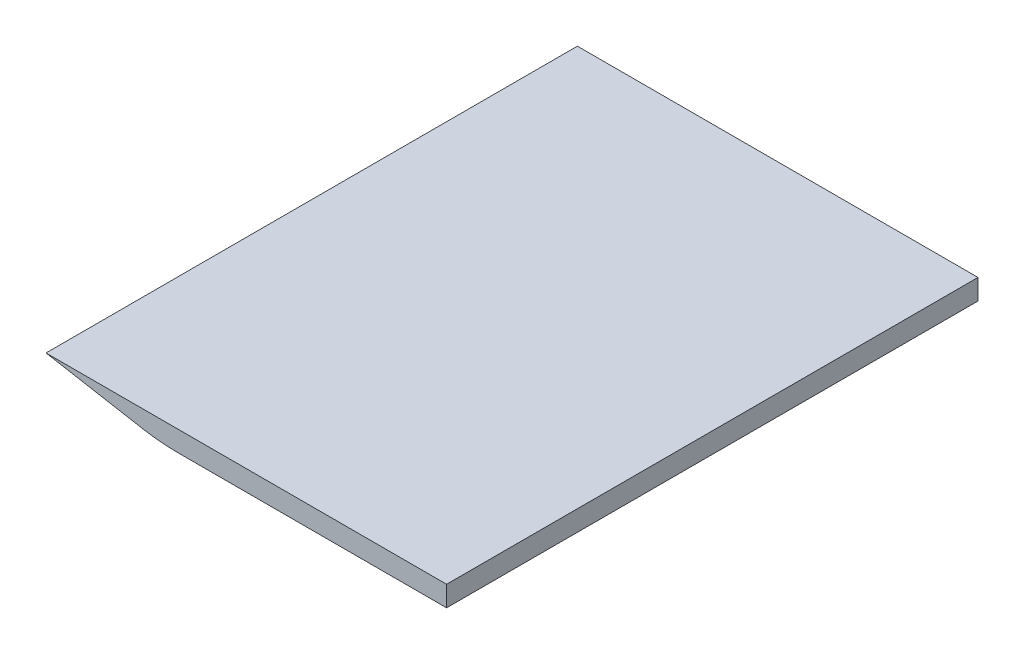
ISO-10303-21;
HEADER;
FILE_DESCRIPTION(('STEP AP214'),'2;1');
FILE_NAME('part.step','',(''),(''),'','','');
FILE_SCHEMA(('AUTOMOTIVE_DESIGN { 1 0 10303 214 1 1 1 1 }'));
ENDSEC;
DATA;
#1=APPLICATION_CONTEXT('core data for automotive mechanical design processes');
#2=APPLICATION_PROTOCOL_DEFINITION('international standard','automotive_design',2000,#1);
#3=PRODUCT_CONTEXT('',#1,'mechanical');
#4=PRODUCT('Part','Part','',(#3));
#5=PRODUCT_RELATED_PRODUCT_CATEGORY('part','',(#4));
#6=PRODUCT_DEFINITION_FORMATION('','',#4);
#7=PRODUCT_DEFINITION_CONTEXT('part definition',#1,'design');
#8=PRODUCT_DEFINITION('design','',#6,#7);
#9=PRODUCT_DEFINITION_SHAPE('','',#8);
#10=(LENGTH_UNIT() NAMED_UNIT(*) SI_UNIT(.MILLI.,.METRE.));
#11=(NAMED_UNIT(*) PLANE_ANGLE_UNIT() SI_UNIT($,.RADIAN.));
#12=(NAMED_UNIT(*) SI_UNIT($,.STERADIAN.) SOLID_ANGLE_UNIT());
#13=UNCERTAINTY_MEASURE_WITH_UNIT(LENGTH_MEASURE(1.E-05),#10,'distance_accuracy_value','');
#14=(GEOMETRIC_REPRESENTATION_CONTEXT(3) GLOBAL_UNCERTAINTY_ASSIGNED_CONTEXT((#13)) GLOBAL_UNIT_ASSIGNED_CONTEXT((#10,
#11,#12)) REPRESENTATION_CONTEXT('',''));
#15=CARTESIAN_POINT('',(0.,0.,0.));
#16=DIRECTION('',(0.,0.,1.));
#17=DIRECTION('',(1.,0.,0.));
#18=AXIS2_PLACEMENT_3D('',#15,#16,#17);
#19=CARTESIAN_POINT('',(28.,-5.,130.));
#20=DIRECTION('',(0.175790638483658,0.984427575508482,0.));
#21=DIRECTION('',(-0.984427575508482,0.175790638483658,0.));
#22=AXIS2_PLACEMENT_3D('',#19,#20,#21);
#23=PLANE('',#22);
#24=DIRECTION('',(0.984427575508482,-0.175790638483658,0.));
#25=VECTOR('',#24,1.);
#26=CARTESIAN_POINT('',(28.,-5.,0.));
#27=LINE('',#26,#25);
#28=CARTESIAN_POINT('',(0.,0.,0.));
#29=VERTEX_POINT('',#28);
#30=CARTESIAN_POINT('',(23.6397211423749,-4.2213787754241,0.));
#31=VERTEX_POINT('',#30);
#32=EDGE_CURVE('E115',#29,#31,#27,.T.);
#33=ORIENTED_EDGE('',*,*,#32,.T.);
#34=DIRECTION('',(0.,0.,-1.));
#35=VECTOR('',#34,1.);
#36=CARTESIAN_POINT('',(23.6397211423749,-4.2213787754241,130.));
#37=LINE('',#36,#35);
#38=CARTESIAN_POINT('',(23.6397211423749,-4.2213787754241,130.));
#39=VERTEX_POINT('',#38);
#40=EDGE_CURVE('E47',#31,#39,#37,.F.);
#41=ORIENTED_EDGE('',*,*,#40,.T.);
#42=DIRECTION('',(0.984427575508482,-0.175790638483658,0.));
#43=VECTOR('',#42,1.);
#44=CARTESIAN_POINT('',(28.,-5.,130.));
#45=LINE('',#44,#43);
#46=CARTESIAN_POINT('',(0.,0.,130.));
#47=VERTEX_POINT('',#46);
#48=EDGE_CURVE('E95',#47,#39,#45,.T.);
#49=ORIENTED_EDGE('',*,*,#48,.F.);
#50=DIRECTION('',(0.,0.,-1.));
#51=VECTOR('',#50,1.);
#52=CARTESIAN_POINT('',(0.,0.,130.));
#53=LINE('',#52,#51);
#54=EDGE_CURVE('E111',#47,#29,#53,.T.);
#55=ORIENTED_EDGE('',*,*,#54,.T.);
#56=EDGE_LOOP('',(#33,#41,#49,#55));
#57=FACE_BOUND('',#56,.T.);
#58=ADVANCED_FACE('F39',(#57),#23,.F.);
#59=CARTESIAN_POINT('',(98.,-5.00000000000003,130.));
#60=DIRECTION('',(0.,1.,0.));
#61=DIRECTION('',(-1.,0.,0.));
#62=AXIS2_PLACEMENT_3D('',#59,#60,#61);
#63=PLANE('',#62);
#64=DIRECTION('',(1.,0.,0.));
#65=VECTOR('',#64,1.);
#66=CARTESIAN_POINT('',(98.,-5.00000000000003,130.));
#67=LINE('',#66,#65);
#68=CARTESIAN_POINT('',(32.4292530665578,-5.,130.));
#69=VERTEX_POINT('',#68);
#70=CARTESIAN_POINT('',(98.,-5.00000000000003,130.));
#71=VERTEX_POINT('',#70);
#72=EDGE_CURVE('E85',#69,#71,#67,.T.);
#73=ORIENTED_EDGE('',*,*,#72,.F.);
#74=DIRECTION('',(0.,0.,-1.));
#75=VECTOR('',#74,1.);
#76=CARTESIAN_POINT('',(32.4292530665578,-5.,130.));
#77=LINE('',#76,#75);
#78=CARTESIAN_POINT('',(32.4292530665578,-5.,0.));
#79=VERTEX_POINT('',#78);
#80=EDGE_CURVE('E103',#69,#79,#77,.T.);
#81=ORIENTED_EDGE('',*,*,#80,.T.);
#82=DIRECTION('',(1.,0.,0.));
#83=VECTOR('',#82,1.);
#84=CARTESIAN_POINT('',(98.,-5.00000000000003,0.));
#85=LINE('',#84,#83);
#86=CARTESIAN_POINT('',(98.,-5.00000000000003,0.));
#87=VERTEX_POINT('',#86);
#88=EDGE_CURVE('E100',#79,#87,#85,.T.);
#89=ORIENTED_EDGE('',*,*,#88,.T.);
#90=DIRECTION('',(0.,0.,-1.));
#91=VECTOR('',#90,1.);
#92=CARTESIAN_POINT('',(98.,-5.00000000000003,130.));
#93=LINE('',#92,#91);
#94=EDGE_CURVE('E98',#71,#87,#93,.T.);
#95=ORIENTED_EDGE('',*,*,#94,.F.);
#96=EDGE_LOOP('',(#73,#81,#89,#95));
#97=FACE_BOUND('',#96,.T.);
#98=ADVANCED_FACE('F99',(#97),#63,.F.);
#99=CARTESIAN_POINT('',(98.,0.,130.));
#100=DIRECTION('',(-1.,0.,0.));
#101=DIRECTION('',(0.,0.,1.));
#102=AXIS2_PLACEMENT_3D('',#99,#100,#101);
#103=PLANE('',#102);
#104=DIRECTION('',(0.,1.,0.));
#105=VECTOR('',#104,1.);
#106=CARTESIAN_POINT('',(98.,0.,0.));
#107=LINE('',#106,#105);
#108=CARTESIAN_POINT('',(98.,0.,0.));
#109=VERTEX_POINT('',#108);
#110=EDGE_CURVE('E118',#87,#109,#107,.T.);
#111=ORIENTED_EDGE('',*,*,#110,.T.);
#112=DIRECTION('',(0.,0.,-1.));
#113=VECTOR('',#112,1.);
#114=CARTESIAN_POINT('',(98.,0.,130.));
#115=LINE('',#114,#113);
#116=CARTESIAN_POINT('',(98.,0.,130.));
#117=VERTEX_POINT('',#116);
#118=EDGE_CURVE('E104',#117,#109,#115,.T.);
#119=ORIENTED_EDGE('',*,*,#118,.F.);
#120=DIRECTION('',(0.,1.,0.));
#121=VECTOR('',#120,1.);
#122=CARTESIAN_POINT('',(98.,0.,130.));
#123=LINE('',#122,#121);
#124=EDGE_CURVE('E89',#71,#117,#123,.T.);
#125=ORIENTED_EDGE('',*,*,#124,.F.);
#126=ORIENTED_EDGE('',*,*,#94,.T.);
#127=EDGE_LOOP('',(#111,#119,#125,#126));
#128=FACE_BOUND('',#127,.T.);
#129=ADVANCED_FACE('F106',(#128),#103,.F.);
#130=CARTESIAN_POINT('',(0.,0.,130.));
#131=DIRECTION('',(0.,-1.,0.));
#132=DIRECTION('',(1.,0.,0.));
#133=AXIS2_PLACEMENT_3D('',#130,#131,#132);
#134=PLANE('',#133);
#135=DIRECTION('',(-1.,0.,0.));
#136=VECTOR('',#135,1.);
#137=CARTESIAN_POINT('',(0.,0.,0.));
#138=LINE('',#137,#136);
#139=EDGE_CURVE('E120',#109,#29,#138,.T.);
#140=ORIENTED_EDGE('',*,*,#139,.T.);
#141=ORIENTED_EDGE('',*,*,#54,.F.);
#142=DIRECTION('',(-1.,0.,0.));
#143=VECTOR('',#142,1.);
#144=CARTESIAN_POINT('',(0.,0.,130.));
#145=LINE('',#144,#143);
#146=EDGE_CURVE('E109',#117,#47,#145,.T.);
#147=ORIENTED_EDGE('',*,*,#146,.F.);
#148=ORIENTED_EDGE('',*,*,#118,.T.);
#149=EDGE_LOOP('',(#140,#141,#147,#148));
#150=FACE_BOUND('',#149,.T.);
#151=ADVANCED_FACE('F130',(#150),#134,.F.);
#152=CARTESIAN_POINT('',(0.,0.,130.));
#153=DIRECTION('',(0.,0.,1.));
#154=DIRECTION('',(1.,0.,0.));
#155=AXIS2_PLACEMENT_3D('',#152,#153,#154);
#156=PLANE('',#155);
#157=ORIENTED_EDGE('',*,*,#48,.T.);
#158=CARTESIAN_POINT('',(32.4292530665578,45.,130.));
#159=DIRECTION('',(0.,0.,1.));
#160=DIRECTION('',(1.,0.,0.));
#161=AXIS2_PLACEMENT_3D('',#158,#159,#160);
#162=CIRCLE('',#161,50.);
#163=EDGE_CURVE('E11',#39,#69,#162,.T.);
#164=ORIENTED_EDGE('',*,*,#163,.T.);
#165=ORIENTED_EDGE('',*,*,#72,.T.);
#166=ORIENTED_EDGE('',*,*,#124,.T.);
#167=ORIENTED_EDGE('',*,*,#146,.T.);
#168=EDGE_LOOP('',(#157,#164,#165,#166,#167));
#169=FACE_BOUND('',#168,.T.);
#170=ADVANCED_FACE('F87',(#169),#156,.T.);
#171=CARTESIAN_POINT('',(0.,0.,0.));
#172=DIRECTION('',(0.,0.,1.));
#173=DIRECTION('',(1.,0.,0.));
#174=AXIS2_PLACEMENT_3D('',#171,#172,#173);
#175=PLANE('',#174);
#176=ORIENTED_EDGE('',*,*,#88,.F.);
#177=CARTESIAN_POINT('',(32.4292530665578,45.,0.));
#178=DIRECTION('',(0.,0.,1.));
#179=DIRECTION('',(1.,0.,0.));
#180=AXIS2_PLACEMENT_3D('',#177,#178,#179);
#181=CIRCLE('',#180,50.);
#182=EDGE_CURVE('E61',#79,#31,#181,.F.);
#183=ORIENTED_EDGE('',*,*,#182,.T.);
#184=ORIENTED_EDGE('',*,*,#32,.F.);
#185=ORIENTED_EDGE('',*,*,#139,.F.);
#186=ORIENTED_EDGE('',*,*,#110,.F.);
#187=EDGE_LOOP('',(#176,#183,#184,#185,#186));
#188=FACE_BOUND('',#187,.T.);
#189=ADVANCED_FACE('F127',(#188),#175,.F.);
#190=CARTESIAN_POINT('',(32.4292530665578,45.,130.));
#191=DIRECTION('',(0.,0.,-1.));
#192=DIRECTION('',(-1.,0.,0.));
#193=AXIS2_PLACEMENT_3D('',#190,#191,#192);
#194=CYLINDRICAL_SURFACE('',#193,50.);
#195=ORIENTED_EDGE('',*,*,#163,.F.);
#196=ORIENTED_EDGE('',*,*,#40,.F.);
#197=ORIENTED_EDGE('',*,*,#182,.F.);
#198=ORIENTED_EDGE('',*,*,#80,.F.);
#199=EDGE_LOOP('',(#195,#196,#197,#198));
#200=FACE_BOUND('',#199,.T.);
#201=ADVANCED_FACE('F41',(#200),#194,.T.);
#202=CLOSED_SHELL('',(#58,#98,#129,#151,#170,#189,#201));
#203=MANIFOLD_SOLID_BREP('B2',#202);
#204=ADVANCED_BREP_SHAPE_REPRESENTATION('',(#18,#203),#14);
#205=SHAPE_DEFINITION_REPRESENTATION(#9,#204);
ENDSEC;
END-ISO-10303-21;
